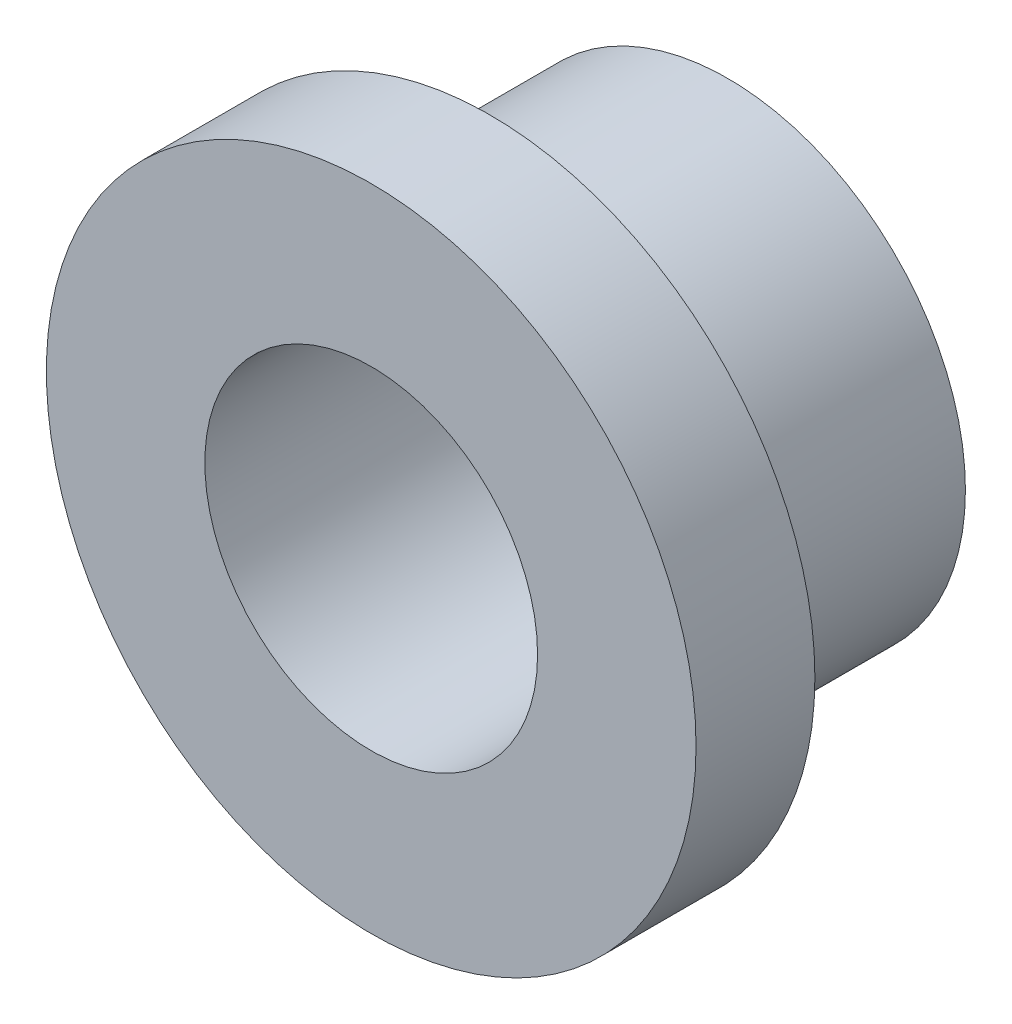
ISO-10303-21;
HEADER;
FILE_DESCRIPTION(('STEP AP214'),'2;1');
FILE_NAME('part.step','',(''),(''),'','','');
FILE_SCHEMA(('AUTOMOTIVE_DESIGN { 1 0 10303 214 1 1 1 1 }'));
ENDSEC;
DATA;
#1=APPLICATION_CONTEXT('core data for automotive mechanical design processes');
#2=APPLICATION_PROTOCOL_DEFINITION('international standard','automotive_design',2000,#1);
#3=PRODUCT_CONTEXT('',#1,'mechanical');
#4=PRODUCT('Part','Part','',(#3));
#5=PRODUCT_RELATED_PRODUCT_CATEGORY('part','',(#4));
#6=PRODUCT_DEFINITION_FORMATION('','',#4);
#7=PRODUCT_DEFINITION_CONTEXT('part definition',#1,'design');
#8=PRODUCT_DEFINITION('design','',#6,#7);
#9=PRODUCT_DEFINITION_SHAPE('','',#8);
#10=(LENGTH_UNIT() NAMED_UNIT(*) SI_UNIT(.MILLI.,.METRE.));
#11=(NAMED_UNIT(*) PLANE_ANGLE_UNIT() SI_UNIT($,.RADIAN.));
#12=(NAMED_UNIT(*) SI_UNIT($,.STERADIAN.) SOLID_ANGLE_UNIT());
#13=UNCERTAINTY_MEASURE_WITH_UNIT(LENGTH_MEASURE(1.E-05),#10,'distance_accuracy_value','');
#14=(GEOMETRIC_REPRESENTATION_CONTEXT(3) GLOBAL_UNCERTAINTY_ASSIGNED_CONTEXT((#13)) GLOBAL_UNIT_ASSIGNED_CONTEXT((#10,
#11,#12)) REPRESENTATION_CONTEXT('',''));
#15=CARTESIAN_POINT('',(0.,0.,0.));
#16=DIRECTION('',(0.,0.,1.));
#17=DIRECTION('',(1.,0.,0.));
#18=AXIS2_PLACEMENT_3D('',#15,#16,#17);
#19=CARTESIAN_POINT('',(0.,0.,8.03045048720723));
#20=DIRECTION('',(0.,0.,1.));
#21=DIRECTION('',(1.,0.,0.));
#22=AXIS2_PLACEMENT_3D('',#19,#20,#21);
#23=CYLINDRICAL_SURFACE('',#22,2.1);
#24=CARTESIAN_POINT('',(0.,0.,-4.5));
#25=DIRECTION('',(0.,0.,1.));
#26=DIRECTION('',(1.,0.,0.));
#27=AXIS2_PLACEMENT_3D('',#24,#25,#26);
#28=CIRCLE('',#27,2.1);
#29=CARTESIAN_POINT('',(2.1,0.,-4.5));
#30=VERTEX_POINT('',#29);
#31=EDGE_CURVE('E57',#30,#30,#28,.T.);
#32=ORIENTED_EDGE('',*,*,#31,.F.);
#33=EDGE_LOOP('',(#32));
#34=FACE_BOUND('',#33,.T.);
#35=CARTESIAN_POINT('',(0.,0.,0.));
#36=DIRECTION('',(0.,0.,1.));
#37=DIRECTION('',(1.,0.,0.));
#38=AXIS2_PLACEMENT_3D('',#35,#36,#37);
#39=CIRCLE('',#38,2.1);
#40=CARTESIAN_POINT('',(2.1,0.,0.));
#41=VERTEX_POINT('',#40);
#42=EDGE_CURVE('E10',#41,#41,#39,.T.);
#43=ORIENTED_EDGE('',*,*,#42,.T.);
#44=EDGE_LOOP('',(#43));
#45=FACE_BOUND('',#44,.T.);
#46=ADVANCED_FACE('F35',(#34,#45),#23,.F.);
#47=CARTESIAN_POINT('',(0.,2.1,0.));
#48=DIRECTION('',(0.,0.,-1.));
#49=DIRECTION('',(-1.,0.,0.));
#50=AXIS2_PLACEMENT_3D('',#47,#48,#49);
#51=PLANE('',#50);
#52=ORIENTED_EDGE('',*,*,#42,.F.);
#53=EDGE_LOOP('',(#52));
#54=FACE_BOUND('',#53,.T.);
#55=CARTESIAN_POINT('',(0.,0.,0.));
#56=DIRECTION('',(0.,0.,1.));
#57=DIRECTION('',(1.,0.,0.));
#58=AXIS2_PLACEMENT_3D('',#55,#56,#57);
#59=CIRCLE('',#58,4.1);
#60=CARTESIAN_POINT('',(4.1,0.,0.));
#61=VERTEX_POINT('',#60);
#62=EDGE_CURVE('E41',#61,#61,#59,.T.);
#63=ORIENTED_EDGE('',*,*,#62,.T.);
#64=EDGE_LOOP('',(#63));
#65=FACE_BOUND('',#64,.T.);
#66=ADVANCED_FACE('F64',(#54,#65),#51,.F.);
#67=CARTESIAN_POINT('',(0.,0.,8.03045048720723));
#68=DIRECTION('',(0.,0.,1.));
#69=DIRECTION('',(1.,0.,0.));
#70=AXIS2_PLACEMENT_3D('',#67,#68,#69);
#71=CYLINDRICAL_SURFACE('',#70,4.1);
#72=ORIENTED_EDGE('',*,*,#62,.F.);
#73=EDGE_LOOP('',(#72));
#74=FACE_BOUND('',#73,.T.);
#75=CARTESIAN_POINT('',(0.,0.,-1.5));
#76=DIRECTION('',(0.,0.,1.));
#77=DIRECTION('',(1.,0.,0.));
#78=AXIS2_PLACEMENT_3D('',#75,#76,#77);
#79=CIRCLE('',#78,4.1);
#80=CARTESIAN_POINT('',(4.1,0.,-1.5));
#81=VERTEX_POINT('',#80);
#82=EDGE_CURVE('E45',#81,#81,#79,.T.);
#83=ORIENTED_EDGE('',*,*,#82,.T.);
#84=EDGE_LOOP('',(#83));
#85=FACE_BOUND('',#84,.T.);
#86=ADVANCED_FACE('F68',(#74,#85),#71,.T.);
#87=CARTESIAN_POINT('',(0.,4.1,-1.5));
#88=DIRECTION('',(0.,0.,1.));
#89=DIRECTION('',(1.,0.,0.));
#90=AXIS2_PLACEMENT_3D('',#87,#88,#89);
#91=PLANE('',#90);
#92=ORIENTED_EDGE('',*,*,#82,.F.);
#93=EDGE_LOOP('',(#92));
#94=FACE_BOUND('',#93,.T.);
#95=CARTESIAN_POINT('',(0.,0.,-1.5));
#96=DIRECTION('',(0.,0.,1.));
#97=DIRECTION('',(1.,0.,0.));
#98=AXIS2_PLACEMENT_3D('',#95,#96,#97);
#99=CIRCLE('',#98,3.);
#100=CARTESIAN_POINT('',(3.,0.,-1.5));
#101=VERTEX_POINT('',#100);
#102=EDGE_CURVE('E49',#101,#101,#99,.T.);
#103=ORIENTED_EDGE('',*,*,#102,.T.);
#104=EDGE_LOOP('',(#103));
#105=FACE_BOUND('',#104,.T.);
#106=ADVANCED_FACE('F73',(#94,#105),#91,.F.);
#107=CARTESIAN_POINT('',(0.,0.,8.03045048720723));
#108=DIRECTION('',(0.,0.,1.));
#109=DIRECTION('',(1.,0.,0.));
#110=AXIS2_PLACEMENT_3D('',#107,#108,#109);
#111=CYLINDRICAL_SURFACE('',#110,3.);
#112=ORIENTED_EDGE('',*,*,#102,.F.);
#113=EDGE_LOOP('',(#112));
#114=FACE_BOUND('',#113,.T.);
#115=CARTESIAN_POINT('',(0.,0.,-4.5));
#116=DIRECTION('',(0.,0.,1.));
#117=DIRECTION('',(1.,0.,0.));
#118=AXIS2_PLACEMENT_3D('',#115,#116,#117);
#119=CIRCLE('',#118,3.);
#120=CARTESIAN_POINT('',(3.,0.,-4.5));
#121=VERTEX_POINT('',#120);
#122=EDGE_CURVE('E54',#121,#121,#119,.T.);
#123=ORIENTED_EDGE('',*,*,#122,.T.);
#124=EDGE_LOOP('',(#123));
#125=FACE_BOUND('',#124,.T.);
#126=ADVANCED_FACE('F79',(#114,#125),#111,.T.);
#127=CARTESIAN_POINT('',(0.,3.,-4.5));
#128=DIRECTION('',(0.,0.,1.));
#129=DIRECTION('',(1.,0.,0.));
#130=AXIS2_PLACEMENT_3D('',#127,#128,#129);
#131=PLANE('',#130);
#132=ORIENTED_EDGE('',*,*,#122,.F.);
#133=EDGE_LOOP('',(#132));
#134=FACE_BOUND('',#133,.T.);
#135=ORIENTED_EDGE('',*,*,#31,.T.);
#136=EDGE_LOOP('',(#135));
#137=FACE_BOUND('',#136,.T.);
#138=ADVANCED_FACE('F61',(#134,#137),#131,.F.);
#139=CLOSED_SHELL('',(#46,#66,#86,#106,#126,#138));
#140=MANIFOLD_SOLID_BREP('B2',#139);
#141=ADVANCED_BREP_SHAPE_REPRESENTATION('',(#18,#140),#14);
#142=SHAPE_DEFINITION_REPRESENTATION(#9,#141);
ENDSEC;
END-ISO-10303-21;
